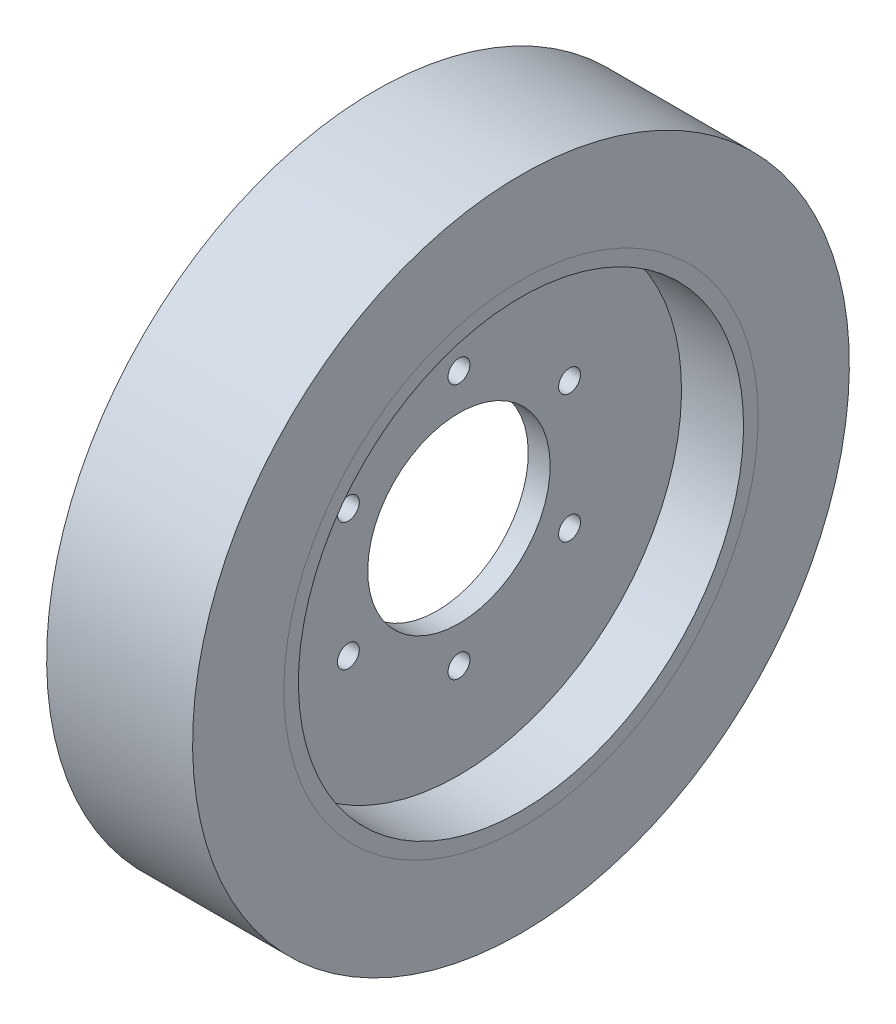
ISO-10303-21;
HEADER;
FILE_DESCRIPTION(('STEP AP214'),'2;1');
FILE_NAME('part.step','',(''),(''),'','','');
FILE_SCHEMA(('AUTOMOTIVE_DESIGN { 1 0 10303 214 1 1 1 1 }'));
ENDSEC;
DATA;
#1=APPLICATION_CONTEXT('core data for automotive mechanical design processes');
#2=APPLICATION_PROTOCOL_DEFINITION('international standard','automotive_design',2000,#1);
#3=PRODUCT_CONTEXT('',#1,'mechanical');
#4=PRODUCT('Part','Part','',(#3));
#5=PRODUCT_RELATED_PRODUCT_CATEGORY('part','',(#4));
#6=PRODUCT_DEFINITION_FORMATION('','',#4);
#7=PRODUCT_DEFINITION_CONTEXT('part definition',#1,'design');
#8=PRODUCT_DEFINITION('design','',#6,#7);
#9=PRODUCT_DEFINITION_SHAPE('','',#8);
#10=(LENGTH_UNIT() NAMED_UNIT(*) SI_UNIT(.MILLI.,.METRE.));
#11=(NAMED_UNIT(*) PLANE_ANGLE_UNIT() SI_UNIT($,.RADIAN.));
#12=(NAMED_UNIT(*) SI_UNIT($,.STERADIAN.) SOLID_ANGLE_UNIT());
#13=UNCERTAINTY_MEASURE_WITH_UNIT(LENGTH_MEASURE(1.E-05),#10,'distance_accuracy_value','');
#14=(GEOMETRIC_REPRESENTATION_CONTEXT(3) GLOBAL_UNCERTAINTY_ASSIGNED_CONTEXT((#13)) GLOBAL_UNIT_ASSIGNED_CONTEXT((#10,
#11,#12)) REPRESENTATION_CONTEXT('',''));
#15=CARTESIAN_POINT('',(0.,0.,0.));
#16=DIRECTION('',(0.,0.,1.));
#17=DIRECTION('',(1.,0.,0.));
#18=AXIS2_PLACEMENT_3D('',#15,#16,#17);
#19=CARTESIAN_POINT('',(274.558441227157,0.,0.));
#20=DIRECTION('',(-1.,0.,0.));
#21=DIRECTION('',(0.,-1.,0.));
#22=AXIS2_PLACEMENT_3D('',#19,#20,#21);
#23=CYLINDRICAL_SURFACE('',#22,90.);
#24=CARTESIAN_POINT('',(20.,0.,0.));
#25=DIRECTION('',(-1.,0.,0.));
#26=DIRECTION('',(0.,-1.,0.));
#27=AXIS2_PLACEMENT_3D('',#24,#25,#26);
#28=CIRCLE('',#27,90.);
#29=CARTESIAN_POINT('',(20.,-90.,0.));
#30=VERTEX_POINT('',#29);
#31=EDGE_CURVE('E11',#30,#30,#28,.F.);
#32=ORIENTED_EDGE('',*,*,#31,.F.);
#33=EDGE_LOOP('',(#32));
#34=FACE_BOUND('',#33,.T.);
#35=CARTESIAN_POINT('',(-20.,0.,0.));
#36=DIRECTION('',(-1.,0.,0.));
#37=DIRECTION('',(0.,-1.,0.));
#38=AXIS2_PLACEMENT_3D('',#35,#36,#37);
#39=CIRCLE('',#38,90.);
#40=CARTESIAN_POINT('',(-20.,-90.,0.));
#41=VERTEX_POINT('',#40);
#42=EDGE_CURVE('E50',#41,#41,#39,.T.);
#43=ORIENTED_EDGE('',*,*,#42,.F.);
#44=EDGE_LOOP('',(#43));
#45=FACE_BOUND('',#44,.T.);
#46=ADVANCED_FACE('F39',(#34,#45),#23,.T.);
#47=CARTESIAN_POINT('',(-20.,0.,0.));
#48=DIRECTION('',(-1.,0.,0.));
#49=DIRECTION('',(0.,-1.,0.));
#50=AXIS2_PLACEMENT_3D('',#47,#48,#49);
#51=PLANE('',#50);
#52=CARTESIAN_POINT('',(-20.,0.,0.));
#53=DIRECTION('',(-1.,0.,0.));
#54=DIRECTION('',(0.,-1.,0.));
#55=AXIS2_PLACEMENT_3D('',#52,#53,#54);
#56=CIRCLE('',#55,65.);
#57=CARTESIAN_POINT('',(-20.,-65.,0.));
#58=VERTEX_POINT('',#57);
#59=EDGE_CURVE('E52',#58,#58,#56,.T.);
#60=ORIENTED_EDGE('',*,*,#59,.F.);
#61=EDGE_LOOP('',(#60));
#62=FACE_BOUND('',#61,.T.);
#63=ORIENTED_EDGE('',*,*,#42,.T.);
#64=EDGE_LOOP('',(#63));
#65=FACE_BOUND('',#64,.T.);
#66=ADVANCED_FACE('F57',(#62,#65),#51,.T.);
#67=CARTESIAN_POINT('',(274.558441227157,0.,0.));
#68=DIRECTION('',(-1.,0.,0.));
#69=DIRECTION('',(0.,-1.,0.));
#70=AXIS2_PLACEMENT_3D('',#67,#68,#69);
#71=CYLINDRICAL_SURFACE('',#70,65.);
#72=CARTESIAN_POINT('',(20.,0.,0.));
#73=DIRECTION('',(-1.,0.,0.));
#74=DIRECTION('',(0.,-1.,0.));
#75=AXIS2_PLACEMENT_3D('',#72,#73,#74);
#76=CIRCLE('',#75,65.);
#77=CARTESIAN_POINT('',(20.,-65.,0.));
#78=VERTEX_POINT('',#77);
#79=EDGE_CURVE('E42',#78,#78,#76,.F.);
#80=ORIENTED_EDGE('',*,*,#79,.T.);
#81=EDGE_LOOP('',(#80));
#82=FACE_BOUND('',#81,.T.);
#83=ORIENTED_EDGE('',*,*,#59,.T.);
#84=EDGE_LOOP('',(#83));
#85=FACE_BOUND('',#84,.T.);
#86=ADVANCED_FACE('F64',(#82,#85),#71,.F.);
#87=CARTESIAN_POINT('',(20.,65.,0.));
#88=DIRECTION('',(-1.,0.,0.));
#89=DIRECTION('',(0.,-1.,0.));
#90=AXIS2_PLACEMENT_3D('',#87,#88,#89);
#91=PLANE('',#90);
#92=ORIENTED_EDGE('',*,*,#31,.T.);
#93=EDGE_LOOP('',(#92));
#94=FACE_BOUND('',#93,.T.);
#95=ORIENTED_EDGE('',*,*,#79,.F.);
#96=EDGE_LOOP('',(#95));
#97=FACE_BOUND('',#96,.T.);
#98=ADVANCED_FACE('F69',(#94,#97),#91,.F.);
#99=CLOSED_SHELL('',(#46,#66,#86,#98));
#100=MANIFOLD_SOLID_BREP('B2',#99);
#101=CARTESIAN_POINT('',(-3.,59.,0.));
#102=DIRECTION('',(1.,0.,0.));
#103=DIRECTION('',(0.,1.,0.));
#104=AXIS2_PLACEMENT_3D('',#101,#102,#103);
#105=PLANE('',#104);
#106=CARTESIAN_POINT('',(-2.99999999999999,17.5,-30.3108891324554));
#107=DIRECTION('',(-1.,0.,0.));
#108=DIRECTION('',(0.,-1.,0.));
#109=AXIS2_PLACEMENT_3D('',#106,#107,#108);
#110=CIRCLE('',#109,3.);
#111=CARTESIAN_POINT('',(-2.99999999999999,14.5,-30.3108891324554));
#112=VERTEX_POINT('',#111);
#113=EDGE_CURVE('E149',#112,#112,#110,.T.);
#114=ORIENTED_EDGE('',*,*,#113,.F.);
#115=EDGE_LOOP('',(#114));
#116=FACE_BOUND('',#115,.T.);
#117=CARTESIAN_POINT('',(-2.99999999999999,-17.5,-30.3108891324554));
#118=DIRECTION('',(-1.,0.,0.));
#119=DIRECTION('',(0.,-1.,0.));
#120=AXIS2_PLACEMENT_3D('',#117,#118,#119);
#121=CIRCLE('',#120,3.);
#122=CARTESIAN_POINT('',(-2.99999999999999,-20.5,-30.3108891324554));
#123=VERTEX_POINT('',#122);
#124=EDGE_CURVE('E152',#123,#123,#121,.T.);
#125=ORIENTED_EDGE('',*,*,#124,.F.);
#126=EDGE_LOOP('',(#125));
#127=FACE_BOUND('',#126,.T.);
#128=CARTESIAN_POINT('',(-2.99999999999999,-35.,0.));
#129=DIRECTION('',(-1.,0.,0.));
#130=DIRECTION('',(0.,-1.,0.));
#131=AXIS2_PLACEMENT_3D('',#128,#129,#130);
#132=CIRCLE('',#131,3.);
#133=CARTESIAN_POINT('',(-2.99999999999999,-38.,0.));
#134=VERTEX_POINT('',#133);
#135=EDGE_CURVE('E155',#134,#134,#132,.T.);
#136=ORIENTED_EDGE('',*,*,#135,.F.);
#137=EDGE_LOOP('',(#136));
#138=FACE_BOUND('',#137,.T.);
#139=CARTESIAN_POINT('',(-2.99999999999999,-17.5,30.3108891324554));
#140=DIRECTION('',(-1.,0.,0.));
#141=DIRECTION('',(0.,-1.,0.));
#142=AXIS2_PLACEMENT_3D('',#139,#140,#141);
#143=CIRCLE('',#142,3.);
#144=CARTESIAN_POINT('',(-2.99999999999999,-20.5,30.3108891324554));
#145=VERTEX_POINT('',#144);
#146=EDGE_CURVE('E158',#145,#145,#143,.T.);
#147=ORIENTED_EDGE('',*,*,#146,.F.);
#148=EDGE_LOOP('',(#147));
#149=FACE_BOUND('',#148,.T.);
#150=CARTESIAN_POINT('',(-2.99999999999999,17.5,30.3108891324554));
#151=DIRECTION('',(-1.,0.,0.));
#152=DIRECTION('',(0.,-1.,0.));
#153=AXIS2_PLACEMENT_3D('',#150,#151,#152);
#154=CIRCLE('',#153,3.);
#155=CARTESIAN_POINT('',(-2.99999999999999,14.5,30.3108891324554));
#156=VERTEX_POINT('',#155);
#157=EDGE_CURVE('E161',#156,#156,#154,.T.);
#158=ORIENTED_EDGE('',*,*,#157,.F.);
#159=EDGE_LOOP('',(#158));
#160=FACE_BOUND('',#159,.T.);
#161=CARTESIAN_POINT('',(-3.,35.,0.));
#162=DIRECTION('',(-1.,0.,0.));
#163=DIRECTION('',(0.,-1.,0.));
#164=AXIS2_PLACEMENT_3D('',#161,#162,#163);
#165=CIRCLE('',#164,3.);
#166=CARTESIAN_POINT('',(-3.,32.,0.));
#167=VERTEX_POINT('',#166);
#168=EDGE_CURVE('E148',#167,#167,#165,.T.);
#169=ORIENTED_EDGE('',*,*,#168,.F.);
#170=EDGE_LOOP('',(#169));
#171=FACE_BOUND('',#170,.T.);
#172=CARTESIAN_POINT('',(-3.,0.,0.));
#173=DIRECTION('',(-1.,0.,0.));
#174=DIRECTION('',(0.,-1.,0.));
#175=AXIS2_PLACEMENT_3D('',#172,#173,#174);
#176=CIRCLE('',#175,59.);
#177=CARTESIAN_POINT('',(-2.99999999999999,-59.,0.));
#178=VERTEX_POINT('',#177);
#179=EDGE_CURVE('E118',#178,#178,#176,.T.);
#180=ORIENTED_EDGE('',*,*,#179,.T.);
#181=EDGE_LOOP('',(#180));
#182=FACE_BOUND('',#181,.T.);
#183=CARTESIAN_POINT('',(-2.99999999999999,0.,0.));
#184=DIRECTION('',(-1.,0.,0.));
#185=DIRECTION('',(0.,-1.,0.));
#186=AXIS2_PLACEMENT_3D('',#183,#184,#185);
#187=CIRCLE('',#186,25.);
#188=CARTESIAN_POINT('',(-2.99999999999999,-25.,0.));
#189=VERTEX_POINT('',#188);
#190=EDGE_CURVE('E145',#189,#189,#187,.T.);
#191=ORIENTED_EDGE('',*,*,#190,.F.);
#192=EDGE_LOOP('',(#191));
#193=FACE_BOUND('',#192,.T.);
#194=ADVANCED_FACE('F101',(#116,#127,#138,#149,#160,#171,#182,#193),#105,.F.);
#195=CARTESIAN_POINT('',(20.,65.,0.));
#196=DIRECTION('',(-1.,0.,0.));
#197=DIRECTION('',(0.,-1.,0.));
#198=AXIS2_PLACEMENT_3D('',#195,#196,#197);
#199=PLANE('',#198);
#200=CARTESIAN_POINT('',(20.,0.,0.));
#201=DIRECTION('',(-1.,0.,0.));
#202=DIRECTION('',(0.,-1.,0.));
#203=AXIS2_PLACEMENT_3D('',#200,#201,#202);
#204=CIRCLE('',#203,65.);
#205=CARTESIAN_POINT('',(20.,-65.,0.));
#206=VERTEX_POINT('',#205);
#207=EDGE_CURVE('E38',#206,#206,#204,.T.);
#208=ORIENTED_EDGE('',*,*,#207,.F.);
#209=EDGE_LOOP('',(#208));
#210=FACE_BOUND('',#209,.T.);
#211=CARTESIAN_POINT('',(20.,0.,0.));
#212=DIRECTION('',(-1.,0.,0.));
#213=DIRECTION('',(0.,-1.,0.));
#214=AXIS2_PLACEMENT_3D('',#211,#212,#213);
#215=CIRCLE('',#214,61.);
#216=CARTESIAN_POINT('',(20.,-61.,0.));
#217=VERTEX_POINT('',#216);
#218=EDGE_CURVE('E109',#217,#217,#215,.T.);
#219=ORIENTED_EDGE('',*,*,#218,.T.);
#220=EDGE_LOOP('',(#219));
#221=FACE_BOUND('',#220,.T.);
#222=ADVANCED_FACE('F103',(#210,#221),#199,.F.);
#223=CARTESIAN_POINT('',(-2.99999999999999,0.,0.));
#224=DIRECTION('',(-1.,0.,0.));
#225=DIRECTION('',(0.,-1.,0.));
#226=AXIS2_PLACEMENT_3D('',#223,#224,#225);
#227=CYLINDRICAL_SURFACE('',#226,61.);
#228=ORIENTED_EDGE('',*,*,#218,.F.);
#229=EDGE_LOOP('',(#228));
#230=FACE_BOUND('',#229,.T.);
#231=CARTESIAN_POINT('',(2.99999999999999,0.,0.));
#232=DIRECTION('',(-1.,0.,0.));
#233=DIRECTION('',(0.,-1.,0.));
#234=AXIS2_PLACEMENT_3D('',#231,#232,#233);
#235=CIRCLE('',#234,61.);
#236=CARTESIAN_POINT('',(2.99999999999999,-61.,0.));
#237=VERTEX_POINT('',#236);
#238=EDGE_CURVE('E113',#237,#237,#235,.T.);
#239=ORIENTED_EDGE('',*,*,#238,.T.);
#240=EDGE_LOOP('',(#239));
#241=FACE_BOUND('',#240,.T.);
#242=ADVANCED_FACE('F190',(#230,#241),#227,.F.);
#243=CARTESIAN_POINT('',(2.99999999999999,61.,0.));
#244=DIRECTION('',(-1.,0.,0.));
#245=DIRECTION('',(0.,-1.,0.));
#246=AXIS2_PLACEMENT_3D('',#243,#244,#245);
#247=PLANE('',#246);
#248=CARTESIAN_POINT('',(2.99999999999999,17.5,-30.3108891324554));
#249=DIRECTION('',(-1.,0.,0.));
#250=DIRECTION('',(0.,-1.,0.));
#251=AXIS2_PLACEMENT_3D('',#248,#249,#250);
#252=CIRCLE('',#251,3.);
#253=CARTESIAN_POINT('',(2.99999999999999,14.5,-30.3108891324554));
#254=VERTEX_POINT('',#253);
#255=EDGE_CURVE('E127',#254,#254,#252,.T.);
#256=ORIENTED_EDGE('',*,*,#255,.T.);
#257=EDGE_LOOP('',(#256));
#258=FACE_BOUND('',#257,.T.);
#259=CARTESIAN_POINT('',(2.99999999999999,-17.5,-30.3108891324554));
#260=DIRECTION('',(-1.,0.,0.));
#261=DIRECTION('',(0.,-1.,0.));
#262=AXIS2_PLACEMENT_3D('',#259,#260,#261);
#263=CIRCLE('',#262,3.);
#264=CARTESIAN_POINT('',(2.99999999999999,-20.5,-30.3108891324554));
#265=VERTEX_POINT('',#264);
#266=EDGE_CURVE('E130',#265,#265,#263,.T.);
#267=ORIENTED_EDGE('',*,*,#266,.T.);
#268=EDGE_LOOP('',(#267));
#269=FACE_BOUND('',#268,.T.);
#270=CARTESIAN_POINT('',(3.,-35.,0.));
#271=DIRECTION('',(-1.,0.,0.));
#272=DIRECTION('',(0.,-1.,0.));
#273=AXIS2_PLACEMENT_3D('',#270,#271,#272);
#274=CIRCLE('',#273,3.);
#275=CARTESIAN_POINT('',(3.,-38.,0.));
#276=VERTEX_POINT('',#275);
#277=EDGE_CURVE('E133',#276,#276,#274,.T.);
#278=ORIENTED_EDGE('',*,*,#277,.T.);
#279=EDGE_LOOP('',(#278));
#280=FACE_BOUND('',#279,.T.);
#281=CARTESIAN_POINT('',(2.99999999999999,-17.5,30.3108891324554));
#282=DIRECTION('',(-1.,0.,0.));
#283=DIRECTION('',(0.,-1.,0.));
#284=AXIS2_PLACEMENT_3D('',#281,#282,#283);
#285=CIRCLE('',#284,3.);
#286=CARTESIAN_POINT('',(2.99999999999999,-20.5,30.3108891324554));
#287=VERTEX_POINT('',#286);
#288=EDGE_CURVE('E136',#287,#287,#285,.T.);
#289=ORIENTED_EDGE('',*,*,#288,.T.);
#290=EDGE_LOOP('',(#289));
#291=FACE_BOUND('',#290,.T.);
#292=CARTESIAN_POINT('',(2.99999999999999,17.5,30.3108891324554));
#293=DIRECTION('',(-1.,0.,0.));
#294=DIRECTION('',(0.,-1.,0.));
#295=AXIS2_PLACEMENT_3D('',#292,#293,#294);
#296=CIRCLE('',#295,3.);
#297=CARTESIAN_POINT('',(2.99999999999999,14.5,30.3108891324554));
#298=VERTEX_POINT('',#297);
#299=EDGE_CURVE('E139',#298,#298,#296,.T.);
#300=ORIENTED_EDGE('',*,*,#299,.T.);
#301=EDGE_LOOP('',(#300));
#302=FACE_BOUND('',#301,.T.);
#303=CARTESIAN_POINT('',(2.99999999999999,35.,0.));
#304=DIRECTION('',(-1.,0.,0.));
#305=DIRECTION('',(0.,-1.,0.));
#306=AXIS2_PLACEMENT_3D('',#303,#304,#305);
#307=CIRCLE('',#306,3.);
#308=CARTESIAN_POINT('',(2.99999999999999,32.,0.));
#309=VERTEX_POINT('',#308);
#310=EDGE_CURVE('E142',#309,#309,#307,.T.);
#311=ORIENTED_EDGE('',*,*,#310,.T.);
#312=EDGE_LOOP('',(#311));
#313=FACE_BOUND('',#312,.T.);
#314=CARTESIAN_POINT('',(2.99999999999999,0.,0.));
#315=DIRECTION('',(-1.,0.,0.));
#316=DIRECTION('',(0.,-1.,0.));
#317=AXIS2_PLACEMENT_3D('',#314,#315,#316);
#318=CIRCLE('',#317,25.);
#319=CARTESIAN_POINT('',(2.99999999999999,-25.,0.));
#320=VERTEX_POINT('',#319);
#321=EDGE_CURVE('E105',#320,#320,#318,.T.);
#322=ORIENTED_EDGE('',*,*,#321,.T.);
#323=EDGE_LOOP('',(#322));
#324=FACE_BOUND('',#323,.T.);
#325=ORIENTED_EDGE('',*,*,#238,.F.);
#326=EDGE_LOOP('',(#325));
#327=FACE_BOUND('',#326,.T.);
#328=ADVANCED_FACE('F186',(#258,#269,#280,#291,#302,#313,#324,#327),#247,.F.);
#329=CARTESIAN_POINT('',(-2.99999999999999,0.,0.));
#330=DIRECTION('',(-1.,0.,0.));
#331=DIRECTION('',(0.,-1.,0.));
#332=AXIS2_PLACEMENT_3D('',#329,#330,#331);
#333=CYLINDRICAL_SURFACE('',#332,59.);
#334=ORIENTED_EDGE('',*,*,#179,.F.);
#335=EDGE_LOOP('',(#334));
#336=FACE_BOUND('',#335,.T.);
#337=CARTESIAN_POINT('',(-20.,0.,0.));
#338=DIRECTION('',(-1.,0.,0.));
#339=DIRECTION('',(0.,-1.,0.));
#340=AXIS2_PLACEMENT_3D('',#337,#338,#339);
#341=CIRCLE('',#340,59.);
#342=CARTESIAN_POINT('',(-20.,-59.,0.));
#343=VERTEX_POINT('',#342);
#344=EDGE_CURVE('E121',#343,#343,#341,.T.);
#345=ORIENTED_EDGE('',*,*,#344,.T.);
#346=EDGE_LOOP('',(#345));
#347=FACE_BOUND('',#346,.T.);
#348=ADVANCED_FACE('F189',(#336,#347),#333,.F.);
#349=CARTESIAN_POINT('',(-20.,65.,0.));
#350=DIRECTION('',(1.,0.,0.));
#351=DIRECTION('',(0.,1.,0.));
#352=AXIS2_PLACEMENT_3D('',#349,#350,#351);
#353=PLANE('',#352);
#354=ORIENTED_EDGE('',*,*,#344,.F.);
#355=EDGE_LOOP('',(#354));
#356=FACE_BOUND('',#355,.T.);
#357=CARTESIAN_POINT('',(-20.,0.,0.));
#358=DIRECTION('',(-1.,0.,0.));
#359=DIRECTION('',(0.,-1.,0.));
#360=AXIS2_PLACEMENT_3D('',#357,#358,#359);
#361=CIRCLE('',#360,65.);
#362=CARTESIAN_POINT('',(-20.,-65.,0.));
#363=VERTEX_POINT('',#362);
#364=EDGE_CURVE('E124',#363,#363,#361,.T.);
#365=ORIENTED_EDGE('',*,*,#364,.T.);
#366=EDGE_LOOP('',(#365));
#367=FACE_BOUND('',#366,.T.);
#368=ADVANCED_FACE('F205',(#356,#367),#353,.F.);
#369=CARTESIAN_POINT('',(-2.99999999999999,0.,0.));
#370=DIRECTION('',(-1.,0.,0.));
#371=DIRECTION('',(0.,-1.,0.));
#372=AXIS2_PLACEMENT_3D('',#369,#370,#371);
#373=CYLINDRICAL_SURFACE('',#372,65.);
#374=ORIENTED_EDGE('',*,*,#364,.F.);
#375=EDGE_LOOP('',(#374));
#376=FACE_BOUND('',#375,.T.);
#377=ORIENTED_EDGE('',*,*,#207,.T.);
#378=EDGE_LOOP('',(#377));
#379=FACE_BOUND('',#378,.T.);
#380=ADVANCED_FACE('F209',(#376,#379),#373,.T.);
#381=CARTESIAN_POINT('',(20.,35.,0.));
#382=DIRECTION('',(-1.,0.,0.));
#383=DIRECTION('',(0.,-1.,0.));
#384=AXIS2_PLACEMENT_3D('',#381,#382,#383);
#385=CYLINDRICAL_SURFACE('',#384,3.);
#386=ORIENTED_EDGE('',*,*,#168,.T.);
#387=EDGE_LOOP('',(#386));
#388=FACE_BOUND('',#387,.T.);
#389=ORIENTED_EDGE('',*,*,#310,.F.);
#390=EDGE_LOOP('',(#389));
#391=FACE_BOUND('',#390,.T.);
#392=ADVANCED_FACE('F167',(#388,#391),#385,.F.);
#393=CARTESIAN_POINT('',(20.,17.5,30.3108891324554));
#394=DIRECTION('',(-1.,0.,0.));
#395=DIRECTION('',(0.,-1.,0.));
#396=AXIS2_PLACEMENT_3D('',#393,#394,#395);
#397=CYLINDRICAL_SURFACE('',#396,3.);
#398=ORIENTED_EDGE('',*,*,#157,.T.);
#399=EDGE_LOOP('',(#398));
#400=FACE_BOUND('',#399,.T.);
#401=ORIENTED_EDGE('',*,*,#299,.F.);
#402=EDGE_LOOP('',(#401));
#403=FACE_BOUND('',#402,.T.);
#404=ADVANCED_FACE('F228',(#400,#403),#397,.F.);
#405=CARTESIAN_POINT('',(20.,-17.5,30.3108891324554));
#406=DIRECTION('',(-1.,0.,0.));
#407=DIRECTION('',(0.,-1.,0.));
#408=AXIS2_PLACEMENT_3D('',#405,#406,#407);
#409=CYLINDRICAL_SURFACE('',#408,3.);
#410=ORIENTED_EDGE('',*,*,#146,.T.);
#411=EDGE_LOOP('',(#410));
#412=FACE_BOUND('',#411,.T.);
#413=ORIENTED_EDGE('',*,*,#288,.F.);
#414=EDGE_LOOP('',(#413));
#415=FACE_BOUND('',#414,.T.);
#416=ADVANCED_FACE('F224',(#412,#415),#409,.F.);
#417=CARTESIAN_POINT('',(20.,-35.,0.));
#418=DIRECTION('',(-1.,0.,0.));
#419=DIRECTION('',(0.,-1.,0.));
#420=AXIS2_PLACEMENT_3D('',#417,#418,#419);
#421=CYLINDRICAL_SURFACE('',#420,3.);
#422=ORIENTED_EDGE('',*,*,#135,.T.);
#423=EDGE_LOOP('',(#422));
#424=FACE_BOUND('',#423,.T.);
#425=ORIENTED_EDGE('',*,*,#277,.F.);
#426=EDGE_LOOP('',(#425));
#427=FACE_BOUND('',#426,.T.);
#428=ADVANCED_FACE('F220',(#424,#427),#421,.F.);
#429=CARTESIAN_POINT('',(20.,-17.5,-30.3108891324554));
#430=DIRECTION('',(-1.,0.,0.));
#431=DIRECTION('',(0.,-1.,0.));
#432=AXIS2_PLACEMENT_3D('',#429,#430,#431);
#433=CYLINDRICAL_SURFACE('',#432,3.);
#434=ORIENTED_EDGE('',*,*,#124,.T.);
#435=EDGE_LOOP('',(#434));
#436=FACE_BOUND('',#435,.T.);
#437=ORIENTED_EDGE('',*,*,#266,.F.);
#438=EDGE_LOOP('',(#437));
#439=FACE_BOUND('',#438,.T.);
#440=ADVANCED_FACE('F216',(#436,#439),#433,.F.);
#441=CARTESIAN_POINT('',(20.,17.5,-30.3108891324554));
#442=DIRECTION('',(-1.,0.,0.));
#443=DIRECTION('',(0.,-1.,0.));
#444=AXIS2_PLACEMENT_3D('',#441,#442,#443);
#445=CYLINDRICAL_SURFACE('',#444,3.);
#446=ORIENTED_EDGE('',*,*,#113,.T.);
#447=EDGE_LOOP('',(#446));
#448=FACE_BOUND('',#447,.T.);
#449=ORIENTED_EDGE('',*,*,#255,.F.);
#450=EDGE_LOOP('',(#449));
#451=FACE_BOUND('',#450,.T.);
#452=ADVANCED_FACE('F181',(#448,#451),#445,.F.);
#453=CARTESIAN_POINT('',(20.,0.,0.));
#454=DIRECTION('',(-1.,0.,0.));
#455=DIRECTION('',(0.,-1.,0.));
#456=AXIS2_PLACEMENT_3D('',#453,#454,#455);
#457=CYLINDRICAL_SURFACE('',#456,25.);
#458=ORIENTED_EDGE('',*,*,#190,.T.);
#459=EDGE_LOOP('',(#458));
#460=FACE_BOUND('',#459,.T.);
#461=ORIENTED_EDGE('',*,*,#321,.F.);
#462=EDGE_LOOP('',(#461));
#463=FACE_BOUND('',#462,.T.);
#464=ADVANCED_FACE('F178',(#460,#463),#457,.F.);
#465=CLOSED_SHELL('',(#194,#222,#242,#328,#348,#368,#380,#392,#404,#416,#428,#440,#452,#464));
#466=MANIFOLD_SOLID_BREP('B6',#465);
#467=ADVANCED_BREP_SHAPE_REPRESENTATION('',(#18,#100,#466),#14);
#468=SHAPE_DEFINITION_REPRESENTATION(#9,#467);
ENDSEC;
END-ISO-10303-21;
